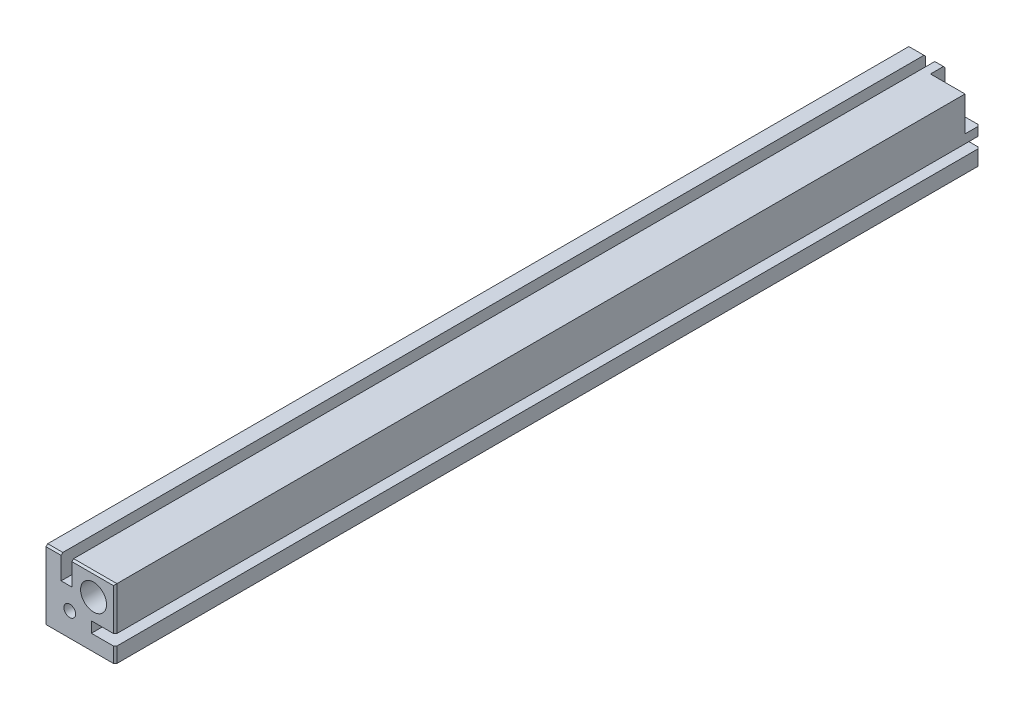
ISO-10303-21;
HEADER;
FILE_DESCRIPTION(('STEP AP214'),'2;1');
FILE_NAME('part.step','',(''),(''),'','','');
FILE_SCHEMA(('AUTOMOTIVE_DESIGN { 1 0 10303 214 1 1 1 1 }'));
ENDSEC;
DATA;
#1=APPLICATION_CONTEXT('core data for automotive mechanical design processes');
#2=APPLICATION_PROTOCOL_DEFINITION('international standard','automotive_design',2000,#1);
#3=PRODUCT_CONTEXT('',#1,'mechanical');
#4=PRODUCT('Part','Part','',(#3));
#5=PRODUCT_RELATED_PRODUCT_CATEGORY('part','',(#4));
#6=PRODUCT_DEFINITION_FORMATION('','',#4);
#7=PRODUCT_DEFINITION_CONTEXT('part definition',#1,'design');
#8=PRODUCT_DEFINITION('design','',#6,#7);
#9=PRODUCT_DEFINITION_SHAPE('','',#8);
#10=(LENGTH_UNIT() NAMED_UNIT(*) SI_UNIT(.MILLI.,.METRE.));
#11=(NAMED_UNIT(*) PLANE_ANGLE_UNIT() SI_UNIT($,.RADIAN.));
#12=(NAMED_UNIT(*) SI_UNIT($,.STERADIAN.) SOLID_ANGLE_UNIT());
#13=UNCERTAINTY_MEASURE_WITH_UNIT(LENGTH_MEASURE(1.E-05),#10,'distance_accuracy_value','');
#14=(GEOMETRIC_REPRESENTATION_CONTEXT(3) GLOBAL_UNCERTAINTY_ASSIGNED_CONTEXT((#13)) GLOBAL_UNIT_ASSIGNED_CONTEXT((#10,
#11,#12)) REPRESENTATION_CONTEXT('',''));
#15=CARTESIAN_POINT('',(0.,0.,0.));
#16=DIRECTION('',(0.,0.,1.));
#17=DIRECTION('',(1.,0.,0.));
#18=AXIS2_PLACEMENT_3D('',#15,#16,#17);
#19=CARTESIAN_POINT('',(-376.613644946817,-0.765886699507383,200.));
#20=DIRECTION('',(-1.,0.,0.));
#21=DIRECTION('',(0.,-1.,0.));
#22=AXIS2_PLACEMENT_3D('',#19,#20,#21);
#23=PLANE('',#22);
#24=DIRECTION('',(0.,0.,1.));
#25=VECTOR('',#24,1.);
#26=CARTESIAN_POINT('',(-376.613644946817,-13.2658866995074,0.));
#27=LINE('',#26,#25);
#28=CARTESIAN_POINT('',(-376.613644946817,-13.2658866995074,0.400000000000073));
#29=VERTEX_POINT('',#28);
#30=CARTESIAN_POINT('',(-376.613644946817,-13.2658866995074,199.6));
#31=VERTEX_POINT('',#30);
#32=EDGE_CURVE('E270',#29,#31,#27,.T.);
#33=ORIENTED_EDGE('',*,*,#32,.T.);
#34=DIRECTION('',(0.,-1.,0.));
#35=VECTOR('',#34,1.);
#36=CARTESIAN_POINT('',(-376.613644946817,-16.7658866995074,199.6));
#37=LINE('',#36,#35);
#38=CARTESIAN_POINT('',(-376.613644946817,-16.7658866995074,199.6));
#39=VERTEX_POINT('',#38);
#40=EDGE_CURVE('E351',#31,#39,#37,.T.);
#41=ORIENTED_EDGE('',*,*,#40,.T.);
#42=DIRECTION('',(0.,0.,-1.));
#43=VECTOR('',#42,1.);
#44=CARTESIAN_POINT('',(-376.613644946817,-16.7658866995074,200.));
#45=LINE('',#44,#43);
#46=CARTESIAN_POINT('',(-376.613644946817,-16.7658866995074,0.400000000000073));
#47=VERTEX_POINT('',#46);
#48=EDGE_CURVE('E318',#39,#47,#45,.T.);
#49=ORIENTED_EDGE('',*,*,#48,.T.);
#50=DIRECTION('',(0.,1.,0.));
#51=VECTOR('',#50,1.);
#52=CARTESIAN_POINT('',(-376.613644946817,-0.765886699507383,0.400000000000073));
#53=LINE('',#52,#51);
#54=EDGE_CURVE('E348',#47,#29,#53,.T.);
#55=ORIENTED_EDGE('',*,*,#54,.T.);
#56=EDGE_LOOP('',(#33,#41,#49,#55));
#57=FACE_BOUND('',#56,.T.);
#58=ADVANCED_FACE('F34',(#57),#23,.F.);
#59=CARTESIAN_POINT('',(-392.613644946817,-0.765886699507383,200.));
#60=DIRECTION('',(0.,-1.,0.));
#61=DIRECTION('',(0.,0.,-1.));
#62=AXIS2_PLACEMENT_3D('',#59,#60,#61);
#63=PLANE('',#62);
#64=DIRECTION('',(0.,0.,-1.));
#65=VECTOR('',#64,1.);
#66=CARTESIAN_POINT('',(-392.613644946817,-0.765886699507383,200.));
#67=LINE('',#66,#65);
#68=CARTESIAN_POINT('',(-392.613644946817,-0.765886699507383,199.6));
#69=VERTEX_POINT('',#68);
#70=CARTESIAN_POINT('',(-392.613644946817,-0.765886699507383,0.400000000000073));
#71=VERTEX_POINT('',#70);
#72=EDGE_CURVE('E327',#69,#71,#67,.T.);
#73=ORIENTED_EDGE('',*,*,#72,.F.);
#74=DIRECTION('',(1.,0.,0.));
#75=VECTOR('',#74,1.);
#76=CARTESIAN_POINT('',(-389.113644946817,-0.765886699507383,199.6));
#77=LINE('',#76,#75);
#78=CARTESIAN_POINT('',(-389.113644946817,-0.765886699507383,199.6));
#79=VERTEX_POINT('',#78);
#80=EDGE_CURVE('E380',#69,#79,#77,.T.);
#81=ORIENTED_EDGE('',*,*,#80,.T.);
#82=DIRECTION('',(0.,0.,1.));
#83=VECTOR('',#82,1.);
#84=CARTESIAN_POINT('',(-389.113644946817,-0.765886699507383,0.));
#85=LINE('',#84,#83);
#86=CARTESIAN_POINT('',(-389.113644946817,-0.765886699507383,0.400000000000073));
#87=VERTEX_POINT('',#86);
#88=EDGE_CURVE('E275',#87,#79,#85,.T.);
#89=ORIENTED_EDGE('',*,*,#88,.F.);
#90=DIRECTION('',(-1.,0.,0.));
#91=VECTOR('',#90,1.);
#92=CARTESIAN_POINT('',(-392.613644946817,-0.765886699507383,0.400000000000073));
#93=LINE('',#92,#91);
#94=EDGE_CURVE('E377',#87,#71,#93,.T.);
#95=ORIENTED_EDGE('',*,*,#94,.T.);
#96=EDGE_LOOP('',(#73,#81,#89,#95));
#97=FACE_BOUND('',#96,.T.);
#98=ADVANCED_FACE('F441',(#97),#63,.F.);
#99=DIRECTION('',(0.,0.,-1.));
#100=VECTOR('',#99,1.);
#101=CARTESIAN_POINT('',(-376.613644946817,-8.76588669950738,3.00000000000011));
#102=LINE('',#101,#100);
#103=CARTESIAN_POINT('',(-376.613644946817,-8.76588669950738,3.4000000000001));
#104=VERTEX_POINT('',#103);
#105=CARTESIAN_POINT('',(-376.613644946817,-8.76588669950738,0.400000000000079));
#106=VERTEX_POINT('',#105);
#107=EDGE_CURVE('E58',#104,#106,#102,.T.);
#108=ORIENTED_EDGE('',*,*,#107,.F.);
#109=DIRECTION('',(0.,1.,0.));
#110=VECTOR('',#109,1.);
#111=CARTESIAN_POINT('',(-376.613644946817,-0.765886699507383,3.4000000000001));
#112=LINE('',#111,#110);
#113=CARTESIAN_POINT('',(-376.613644946817,-0.765886699507383,3.4000000000001));
#114=VERTEX_POINT('',#113);
#115=EDGE_CURVE('E404',#104,#114,#112,.T.);
#116=ORIENTED_EDGE('',*,*,#115,.T.);
#117=DIRECTION('',(0.,0.,-1.));
#118=VECTOR('',#117,1.);
#119=CARTESIAN_POINT('',(-376.613644946817,-0.765886699507383,200.));
#120=LINE('',#119,#118);
#121=CARTESIAN_POINT('',(-376.613644946817,-0.765886699507383,199.6));
#122=VERTEX_POINT('',#121);
#123=EDGE_CURVE('E330',#122,#114,#120,.T.);
#124=ORIENTED_EDGE('',*,*,#123,.F.);
#125=DIRECTION('',(0.,-1.,0.));
#126=VECTOR('',#125,1.);
#127=CARTESIAN_POINT('',(-376.613644946817,-10.7658866995074,199.6));
#128=LINE('',#127,#126);
#129=CARTESIAN_POINT('',(-376.613644946817,-10.7658866995074,199.6));
#130=VERTEX_POINT('',#129);
#131=EDGE_CURVE('E359',#122,#130,#128,.T.);
#132=ORIENTED_EDGE('',*,*,#131,.T.);
#133=DIRECTION('',(0.,0.,1.));
#134=VECTOR('',#133,1.);
#135=CARTESIAN_POINT('',(-376.613644946817,-10.7658866995074,0.));
#136=LINE('',#135,#134);
#137=CARTESIAN_POINT('',(-376.613644946817,-10.7658866995074,0.400000000000073));
#138=VERTEX_POINT('',#137);
#139=EDGE_CURVE('E295',#138,#130,#136,.T.);
#140=ORIENTED_EDGE('',*,*,#139,.F.);
#141=DIRECTION('',(0.,1.,0.));
#142=VECTOR('',#141,1.);
#143=CARTESIAN_POINT('',(-376.613644946817,-0.765886699507383,0.400000000000073));
#144=LINE('',#143,#142);
#145=EDGE_CURVE('E357',#138,#106,#144,.T.);
#146=ORIENTED_EDGE('',*,*,#145,.T.);
#147=EDGE_LOOP('',(#108,#116,#124,#132,#140,#146));
#148=FACE_BOUND('',#147,.T.);
#149=ADVANCED_FACE('F418',(#148),#23,.F.);
#150=ORIENTED_EDGE('',*,*,#123,.T.);
#151=DIRECTION('',(-1.,0.,0.));
#152=VECTOR('',#151,1.);
#153=CARTESIAN_POINT('',(-384.613644946817,-0.765886699507383,3.4000000000001));
#154=LINE('',#153,#152);
#155=CARTESIAN_POINT('',(-384.613644946817,-0.765886699507383,3.4000000000001));
#156=VERTEX_POINT('',#155);
#157=EDGE_CURVE('E406',#114,#156,#154,.T.);
#158=ORIENTED_EDGE('',*,*,#157,.T.);
#159=DIRECTION('',(0.,0.,-1.));
#160=VECTOR('',#159,1.);
#161=CARTESIAN_POINT('',(-384.613644946817,-0.765886699507383,3.00000000000011));
#162=LINE('',#161,#160);
#163=CARTESIAN_POINT('',(-384.613644946817,-0.765886699507383,0.400000000000073));
#164=VERTEX_POINT('',#163);
#165=EDGE_CURVE('E50',#156,#164,#162,.T.);
#166=ORIENTED_EDGE('',*,*,#165,.T.);
#167=DIRECTION('',(-1.,0.,0.));
#168=VECTOR('',#167,1.);
#169=CARTESIAN_POINT('',(-392.613644946817,-0.765886699507383,0.400000000000073));
#170=LINE('',#169,#168);
#171=CARTESIAN_POINT('',(-386.613644946817,-0.765886699507383,0.400000000000073));
#172=VERTEX_POINT('',#171);
#173=EDGE_CURVE('E369',#164,#172,#170,.T.);
#174=ORIENTED_EDGE('',*,*,#173,.T.);
#175=DIRECTION('',(0.,0.,1.));
#176=VECTOR('',#175,1.);
#177=CARTESIAN_POINT('',(-386.613644946817,-0.765886699507383,0.));
#178=LINE('',#177,#176);
#179=CARTESIAN_POINT('',(-386.613644946817,-0.765886699507383,199.6));
#180=VERTEX_POINT('',#179);
#181=EDGE_CURVE('E279',#172,#180,#178,.T.);
#182=ORIENTED_EDGE('',*,*,#181,.T.);
#183=DIRECTION('',(1.,0.,0.));
#184=VECTOR('',#183,1.);
#185=CARTESIAN_POINT('',(-376.613644946817,-0.765886699507383,199.6));
#186=LINE('',#185,#184);
#187=EDGE_CURVE('E371',#180,#122,#186,.T.);
#188=ORIENTED_EDGE('',*,*,#187,.T.);
#189=EDGE_LOOP('',(#150,#158,#166,#174,#182,#188));
#190=FACE_BOUND('',#189,.T.);
#191=ADVANCED_FACE('F422',(#190),#63,.F.);
#192=CARTESIAN_POINT('',(-392.613644946817,-0.765886699507383,200.));
#193=DIRECTION('',(1.,0.,0.));
#194=DIRECTION('',(0.,1.,0.));
#195=AXIS2_PLACEMENT_3D('',#192,#193,#194);
#196=PLANE('',#195);
#197=DIRECTION('',(0.,-1.,0.));
#198=VECTOR('',#197,1.);
#199=CARTESIAN_POINT('',(-392.613644946817,-0.765886699507383,200.));
#200=LINE('',#199,#198);
#201=CARTESIAN_POINT('',(-392.613644946817,-1.16588669950739,200.));
#202=VERTEX_POINT('',#201);
#203=CARTESIAN_POINT('',(-392.613644946817,-16.7658866995074,200.));
#204=VERTEX_POINT('',#203);
#205=EDGE_CURVE('E312',#202,#204,#200,.T.);
#206=ORIENTED_EDGE('',*,*,#205,.F.);
#207=DIRECTION('',(0.,0.707106781186548,-0.707106781186548));
#208=VECTOR('',#207,1.);
#209=CARTESIAN_POINT('',(-392.613644946817,-1.16588669950739,200.));
#210=LINE('',#209,#208);
#211=EDGE_CURVE('E375',#202,#69,#210,.T.);
#212=ORIENTED_EDGE('',*,*,#211,.T.);
#213=ORIENTED_EDGE('',*,*,#72,.T.);
#214=DIRECTION('',(0.,0.707106781186548,0.707106781186548));
#215=VECTOR('',#214,1.);
#216=CARTESIAN_POINT('',(-392.613644946817,-0.765886699507383,0.400000000000073));
#217=LINE('',#216,#215);
#218=CARTESIAN_POINT('',(-392.613644946817,-1.16588669950739,0.));
#219=VERTEX_POINT('',#218);
#220=EDGE_CURVE('E373',#71,#219,#217,.F.);
#221=ORIENTED_EDGE('',*,*,#220,.T.);
#222=DIRECTION('',(0.,-1.,0.));
#223=VECTOR('',#222,1.);
#224=CARTESIAN_POINT('',(-392.613644946817,-0.765886699507383,0.));
#225=LINE('',#224,#223);
#226=CARTESIAN_POINT('',(-392.613644946817,-16.7658866995074,0.));
#227=VERTEX_POINT('',#226);
#228=EDGE_CURVE('E278',#219,#227,#225,.T.);
#229=ORIENTED_EDGE('',*,*,#228,.T.);
#230=DIRECTION('',(0.,0.,-1.));
#231=VECTOR('',#230,1.);
#232=CARTESIAN_POINT('',(-392.613644946817,-16.7658866995074,200.));
#233=LINE('',#232,#231);
#234=EDGE_CURVE('E324',#204,#227,#233,.T.);
#235=ORIENTED_EDGE('',*,*,#234,.F.);
#236=EDGE_LOOP('',(#206,#212,#213,#221,#229,#235));
#237=FACE_BOUND('',#236,.T.);
#238=ADVANCED_FACE('F454',(#237),#196,.F.);
#239=CARTESIAN_POINT('',(-392.613644946817,-16.7658866995074,200.));
#240=DIRECTION('',(0.,1.,0.));
#241=DIRECTION('',(0.,0.,1.));
#242=AXIS2_PLACEMENT_3D('',#239,#240,#241);
#243=PLANE('',#242);
#244=ORIENTED_EDGE('',*,*,#48,.F.);
#245=DIRECTION('',(-0.707106781186548,0.,0.707106781186548));
#246=VECTOR('',#245,1.);
#247=CARTESIAN_POINT('',(-377.013644946817,-16.7658866995074,200.));
#248=LINE('',#247,#246);
#249=CARTESIAN_POINT('',(-377.013644946817,-16.7658866995074,200.));
#250=VERTEX_POINT('',#249);
#251=EDGE_CURVE('E355',#39,#250,#248,.T.);
#252=ORIENTED_EDGE('',*,*,#251,.T.);
#253=DIRECTION('',(1.,0.,0.));
#254=VECTOR('',#253,1.);
#255=CARTESIAN_POINT('',(-392.613644946817,-16.7658866995074,200.));
#256=LINE('',#255,#254);
#257=EDGE_CURVE('E314',#204,#250,#256,.T.);
#258=ORIENTED_EDGE('',*,*,#257,.F.);
#259=ORIENTED_EDGE('',*,*,#234,.T.);
#260=DIRECTION('',(1.,0.,0.));
#261=VECTOR('',#260,1.);
#262=CARTESIAN_POINT('',(-392.613644946817,-16.7658866995074,0.));
#263=LINE('',#262,#261);
#264=CARTESIAN_POINT('',(-377.013644946817,-16.7658866995074,0.));
#265=VERTEX_POINT('',#264);
#266=EDGE_CURVE('E315',#227,#265,#263,.T.);
#267=ORIENTED_EDGE('',*,*,#266,.T.);
#268=DIRECTION('',(-0.707106781186548,0.,-0.707106781186548));
#269=VECTOR('',#268,1.);
#270=CARTESIAN_POINT('',(-376.613644946817,-16.7658866995074,0.400000000000071));
#271=LINE('',#270,#269);
#272=EDGE_CURVE('E353',#265,#47,#271,.F.);
#273=ORIENTED_EDGE('',*,*,#272,.T.);
#274=EDGE_LOOP('',(#244,#252,#258,#259,#267,#273));
#275=FACE_BOUND('',#274,.T.);
#276=ADVANCED_FACE('F458',(#275),#243,.F.);
#277=CARTESIAN_POINT('',(-384.613644946817,-8.76588669950738,200.));
#278=DIRECTION('',(0.,0.,1.));
#279=DIRECTION('',(1.,0.,0.));
#280=AXIS2_PLACEMENT_3D('',#277,#278,#279);
#281=PLANE('',#280);
#282=CARTESIAN_POINT('',(-381.613644946817,-5.76588669950738,200.));
#283=DIRECTION('',(0.,0.,-1.));
#284=DIRECTION('',(-1.,0.,0.));
#285=AXIS2_PLACEMENT_3D('',#282,#283,#284);
#286=CIRCLE('',#285,2.99999999999999);
#287=CARTESIAN_POINT('',(-384.613644946817,-5.76588669950738,200.));
#288=VERTEX_POINT('',#287);
#289=EDGE_CURVE('E220',#288,#288,#286,.T.);
#290=ORIENTED_EDGE('',*,*,#289,.T.);
#291=EDGE_LOOP('',(#290));
#292=FACE_BOUND('',#291,.T.);
#293=CARTESIAN_POINT('',(-387.113644946817,-11.2658866995074,200.));
#294=DIRECTION('',(0.,0.,1.));
#295=DIRECTION('',(1.,0.,0.));
#296=AXIS2_PLACEMENT_3D('',#293,#294,#295);
#297=CIRCLE('',#296,1.34999999999999);
#298=CARTESIAN_POINT('',(-385.763644946817,-11.2658866995074,200.));
#299=VERTEX_POINT('',#298);
#300=EDGE_CURVE('E242',#299,#299,#297,.T.);
#301=ORIENTED_EDGE('',*,*,#300,.F.);
#302=EDGE_LOOP('',(#301));
#303=FACE_BOUND('',#302,.T.);
#304=ORIENTED_EDGE('',*,*,#257,.T.);
#305=DIRECTION('',(0.,1.,0.));
#306=VECTOR('',#305,1.);
#307=CARTESIAN_POINT('',(-377.013644946817,-13.2658866995074,200.));
#308=LINE('',#307,#306);
#309=CARTESIAN_POINT('',(-377.013644946817,-13.2658866995074,200.));
#310=VERTEX_POINT('',#309);
#311=EDGE_CURVE('E341',#250,#310,#308,.T.);
#312=ORIENTED_EDGE('',*,*,#311,.T.);
#313=DIRECTION('',(1.,0.,0.));
#314=VECTOR('',#313,1.);
#315=CARTESIAN_POINT('',(-376.613644946817,-13.2658866995074,200.));
#316=LINE('',#315,#314);
#317=CARTESIAN_POINT('',(-382.113644946817,-13.2658866995074,200.));
#318=VERTEX_POINT('',#317);
#319=EDGE_CURVE('E289',#318,#310,#316,.T.);
#320=ORIENTED_EDGE('',*,*,#319,.F.);
#321=DIRECTION('',(0.,-1.,0.));
#322=VECTOR('',#321,1.);
#323=CARTESIAN_POINT('',(-382.113644946817,-13.2658866995074,200.));
#324=LINE('',#323,#322);
#325=CARTESIAN_POINT('',(-382.113644946817,-10.7658866995074,200.));
#326=VERTEX_POINT('',#325);
#327=EDGE_CURVE('E298',#326,#318,#324,.T.);
#328=ORIENTED_EDGE('',*,*,#327,.F.);
#329=DIRECTION('',(-1.,0.,0.));
#330=VECTOR('',#329,1.);
#331=CARTESIAN_POINT('',(-376.613644946817,-10.7658866995074,200.));
#332=LINE('',#331,#330);
#333=CARTESIAN_POINT('',(-377.013644946817,-10.7658866995074,200.));
#334=VERTEX_POINT('',#333);
#335=EDGE_CURVE('E296',#334,#326,#332,.T.);
#336=ORIENTED_EDGE('',*,*,#335,.F.);
#337=DIRECTION('',(0.,1.,0.));
#338=VECTOR('',#337,1.);
#339=CARTESIAN_POINT('',(-377.013644946817,-0.765886699507383,200.));
#340=LINE('',#339,#338);
#341=CARTESIAN_POINT('',(-377.013644946817,-1.16588669950739,200.));
#342=VERTEX_POINT('',#341);
#343=EDGE_CURVE('E338',#334,#342,#340,.T.);
#344=ORIENTED_EDGE('',*,*,#343,.T.);
#345=DIRECTION('',(-1.,0.,0.));
#346=VECTOR('',#345,1.);
#347=CARTESIAN_POINT('',(-386.613644946817,-1.16588669950739,200.));
#348=LINE('',#347,#346);
#349=CARTESIAN_POINT('',(-386.613644946817,-1.16588669950739,200.));
#350=VERTEX_POINT('',#349);
#351=EDGE_CURVE('E336',#342,#350,#348,.T.);
#352=ORIENTED_EDGE('',*,*,#351,.T.);
#353=DIRECTION('',(0.,1.,0.));
#354=VECTOR('',#353,1.);
#355=CARTESIAN_POINT('',(-386.613644946817,-0.765886699507383,200.));
#356=LINE('',#355,#354);
#357=CARTESIAN_POINT('',(-386.613644946817,-6.26588669950738,200.));
#358=VERTEX_POINT('',#357);
#359=EDGE_CURVE('E260',#358,#350,#356,.T.);
#360=ORIENTED_EDGE('',*,*,#359,.F.);
#361=DIRECTION('',(1.,0.,0.));
#362=VECTOR('',#361,1.);
#363=CARTESIAN_POINT('',(-389.113644946817,-6.26588669950738,200.));
#364=LINE('',#363,#362);
#365=CARTESIAN_POINT('',(-389.113644946817,-6.26588669950738,200.));
#366=VERTEX_POINT('',#365);
#367=EDGE_CURVE('E269',#366,#358,#364,.T.);
#368=ORIENTED_EDGE('',*,*,#367,.F.);
#369=DIRECTION('',(0.,-1.,0.));
#370=VECTOR('',#369,1.);
#371=CARTESIAN_POINT('',(-389.113644946817,-0.765886699507383,200.));
#372=LINE('',#371,#370);
#373=CARTESIAN_POINT('',(-389.113644946817,-1.16588669950739,200.));
#374=VERTEX_POINT('',#373);
#375=EDGE_CURVE('E267',#374,#366,#372,.T.);
#376=ORIENTED_EDGE('',*,*,#375,.F.);
#377=DIRECTION('',(-1.,0.,0.));
#378=VECTOR('',#377,1.);
#379=CARTESIAN_POINT('',(-392.613644946817,-1.16588669950739,200.));
#380=LINE('',#379,#378);
#381=EDGE_CURVE('E333',#374,#202,#380,.T.);
#382=ORIENTED_EDGE('',*,*,#381,.T.);
#383=ORIENTED_EDGE('',*,*,#205,.T.);
#384=EDGE_LOOP('',(#304,#312,#320,#328,#336,#344,#352,#360,#368,#376,#382,#383));
#385=FACE_BOUND('',#384,.T.);
#386=ADVANCED_FACE('F429',(#292,#303,#385),#281,.T.);
#387=CARTESIAN_POINT('',(-384.613644946817,-8.76588669950738,0.));
#388=DIRECTION('',(0.,0.,1.));
#389=DIRECTION('',(1.,0.,0.));
#390=AXIS2_PLACEMENT_3D('',#387,#388,#389);
#391=PLANE('',#390);
#392=CARTESIAN_POINT('',(-387.113644946817,-11.2658866995074,0.));
#393=DIRECTION('',(0.,0.,-1.));
#394=DIRECTION('',(-1.,0.,0.));
#395=AXIS2_PLACEMENT_3D('',#392,#393,#394);
#396=CIRCLE('',#395,1.34999999999999);
#397=CARTESIAN_POINT('',(-388.463644946817,-11.2658866995074,0.));
#398=VERTEX_POINT('',#397);
#399=EDGE_CURVE('E250',#398,#398,#396,.T.);
#400=ORIENTED_EDGE('',*,*,#399,.F.);
#401=EDGE_LOOP('',(#400));
#402=FACE_BOUND('',#401,.T.);
#403=DIRECTION('',(1.,0.,0.));
#404=VECTOR('',#403,1.);
#405=CARTESIAN_POINT('',(-384.613644946817,-1.16588669950739,0.));
#406=LINE('',#405,#404);
#407=CARTESIAN_POINT('',(-386.613644946817,-1.16588669950739,0.));
#408=VERTEX_POINT('',#407);
#409=CARTESIAN_POINT('',(-384.613644946817,-1.16588669950739,0.));
#410=VERTEX_POINT('',#409);
#411=EDGE_CURVE('E390',#408,#410,#406,.T.);
#412=ORIENTED_EDGE('',*,*,#411,.T.);
#413=DIRECTION('',(0.,1.,0.));
#414=VECTOR('',#413,1.);
#415=CARTESIAN_POINT('',(-384.613644946817,-0.765886699507383,1.09543937050044E-13));
#416=LINE('',#415,#414);
#417=CARTESIAN_POINT('',(-384.613644946817,-5.76588669950738,1.09543937050044E-13));
#418=VERTEX_POINT('',#417);
#419=EDGE_CURVE('E235',#418,#410,#416,.T.);
#420=ORIENTED_EDGE('',*,*,#419,.F.);
#421=CARTESIAN_POINT('',(-381.613644946817,-5.76588669950738,1.09543937050044E-13));
#422=DIRECTION('',(0.,0.,-1.));
#423=DIRECTION('',(-1.,0.,0.));
#424=AXIS2_PLACEMENT_3D('',#421,#422,#423);
#425=CIRCLE('',#424,3.);
#426=CARTESIAN_POINT('',(-381.613644946817,-8.76588669950739,1.09543937050044E-13));
#427=VERTEX_POINT('',#426);
#428=EDGE_CURVE('E227',#427,#418,#425,.T.);
#429=ORIENTED_EDGE('',*,*,#428,.F.);
#430=DIRECTION('',(-1.,0.,0.));
#431=VECTOR('',#430,1.);
#432=CARTESIAN_POINT('',(-376.613644946817,-8.76588669950738,1.09543937050044E-13));
#433=LINE('',#432,#431);
#434=CARTESIAN_POINT('',(-377.013644946817,-8.76588669950738,1.09543937050044E-13));
#435=VERTEX_POINT('',#434);
#436=EDGE_CURVE('E238',#435,#427,#433,.T.);
#437=ORIENTED_EDGE('',*,*,#436,.F.);
#438=DIRECTION('',(0.,-1.,0.));
#439=VECTOR('',#438,1.);
#440=CARTESIAN_POINT('',(-377.013644946817,-8.76588669950738,0.));
#441=LINE('',#440,#439);
#442=CARTESIAN_POINT('',(-377.013644946817,-10.7658866995074,0.));
#443=VERTEX_POINT('',#442);
#444=EDGE_CURVE('E388',#435,#443,#441,.T.);
#445=ORIENTED_EDGE('',*,*,#444,.T.);
#446=DIRECTION('',(-1.,0.,0.));
#447=VECTOR('',#446,1.);
#448=CARTESIAN_POINT('',(-376.613644946817,-10.7658866995074,0.));
#449=LINE('',#448,#447);
#450=CARTESIAN_POINT('',(-382.113644946817,-10.7658866995074,0.));
#451=VERTEX_POINT('',#450);
#452=EDGE_CURVE('E286',#443,#451,#449,.T.);
#453=ORIENTED_EDGE('',*,*,#452,.T.);
#454=DIRECTION('',(0.,-1.,0.));
#455=VECTOR('',#454,1.);
#456=CARTESIAN_POINT('',(-382.113644946817,-13.2658866995074,0.));
#457=LINE('',#456,#455);
#458=CARTESIAN_POINT('',(-382.113644946817,-13.2658866995074,0.));
#459=VERTEX_POINT('',#458);
#460=EDGE_CURVE('E288',#451,#459,#457,.T.);
#461=ORIENTED_EDGE('',*,*,#460,.T.);
#462=DIRECTION('',(1.,0.,0.));
#463=VECTOR('',#462,1.);
#464=CARTESIAN_POINT('',(-376.613644946817,-13.2658866995074,0.));
#465=LINE('',#464,#463);
#466=CARTESIAN_POINT('',(-377.013644946817,-13.2658866995074,0.));
#467=VERTEX_POINT('',#466);
#468=EDGE_CURVE('E292',#459,#467,#465,.T.);
#469=ORIENTED_EDGE('',*,*,#468,.T.);
#470=DIRECTION('',(0.,-1.,0.));
#471=VECTOR('',#470,1.);
#472=CARTESIAN_POINT('',(-377.013644946817,-8.76588669950738,0.));
#473=LINE('',#472,#471);
#474=EDGE_CURVE('E393',#467,#265,#473,.T.);
#475=ORIENTED_EDGE('',*,*,#474,.T.);
#476=ORIENTED_EDGE('',*,*,#266,.F.);
#477=ORIENTED_EDGE('',*,*,#228,.F.);
#478=DIRECTION('',(1.,0.,0.));
#479=VECTOR('',#478,1.);
#480=CARTESIAN_POINT('',(-384.613644946817,-1.16588669950739,0.));
#481=LINE('',#480,#479);
#482=CARTESIAN_POINT('',(-389.113644946817,-1.16588669950739,0.));
#483=VERTEX_POINT('',#482);
#484=EDGE_CURVE('E386',#219,#483,#481,.T.);
#485=ORIENTED_EDGE('',*,*,#484,.T.);
#486=DIRECTION('',(0.,-1.,0.));
#487=VECTOR('',#486,1.);
#488=CARTESIAN_POINT('',(-389.113644946817,-0.765886699507383,0.));
#489=LINE('',#488,#487);
#490=CARTESIAN_POINT('',(-389.113644946817,-6.26588669950738,0.));
#491=VERTEX_POINT('',#490);
#492=EDGE_CURVE('E257',#483,#491,#489,.T.);
#493=ORIENTED_EDGE('',*,*,#492,.T.);
#494=DIRECTION('',(1.,0.,0.));
#495=VECTOR('',#494,1.);
#496=CARTESIAN_POINT('',(-389.113644946817,-6.26588669950738,0.));
#497=LINE('',#496,#495);
#498=CARTESIAN_POINT('',(-386.613644946817,-6.26588669950738,0.));
#499=VERTEX_POINT('',#498);
#500=EDGE_CURVE('E259',#491,#499,#497,.T.);
#501=ORIENTED_EDGE('',*,*,#500,.T.);
#502=DIRECTION('',(0.,1.,0.));
#503=VECTOR('',#502,1.);
#504=CARTESIAN_POINT('',(-386.613644946817,-0.765886699507383,0.));
#505=LINE('',#504,#503);
#506=EDGE_CURVE('E263',#499,#408,#505,.T.);
#507=ORIENTED_EDGE('',*,*,#506,.T.);
#508=EDGE_LOOP('',(#412,#420,#429,#437,#445,#453,#461,#469,#475,#476,#477,#485,#493,#501,#507));
#509=FACE_BOUND('',#508,.T.);
#510=ADVANCED_FACE('F465',(#402,#509),#391,.F.);
#511=CARTESIAN_POINT('',(-376.613644946817,-13.2658866995074,0.));
#512=DIRECTION('',(0.,-1.,0.));
#513=DIRECTION('',(1.,0.,0.));
#514=AXIS2_PLACEMENT_3D('',#511,#512,#513);
#515=PLANE('',#514);
#516=ORIENTED_EDGE('',*,*,#319,.T.);
#517=DIRECTION('',(0.707106781186548,0.,-0.707106781186548));
#518=VECTOR('',#517,1.);
#519=CARTESIAN_POINT('',(-377.013644946817,-13.2658866995074,200.));
#520=LINE('',#519,#518);
#521=EDGE_CURVE('E346',#310,#31,#520,.T.);
#522=ORIENTED_EDGE('',*,*,#521,.T.);
#523=ORIENTED_EDGE('',*,*,#32,.F.);
#524=DIRECTION('',(0.707106781186548,0.,0.707106781186548));
#525=VECTOR('',#524,1.);
#526=CARTESIAN_POINT('',(-376.613644946817,-13.2658866995074,0.400000000000072));
#527=LINE('',#526,#525);
#528=EDGE_CURVE('E344',#29,#467,#527,.F.);
#529=ORIENTED_EDGE('',*,*,#528,.T.);
#530=ORIENTED_EDGE('',*,*,#468,.F.);
#531=DIRECTION('',(0.,0.,1.));
#532=VECTOR('',#531,1.);
#533=CARTESIAN_POINT('',(-382.113644946817,-13.2658866995074,0.));
#534=LINE('',#533,#532);
#535=EDGE_CURVE('E305',#459,#318,#534,.T.);
#536=ORIENTED_EDGE('',*,*,#535,.T.);
#537=EDGE_LOOP('',(#516,#522,#523,#529,#530,#536));
#538=FACE_BOUND('',#537,.T.);
#539=ADVANCED_FACE('F468',(#538),#515,.F.);
#540=CARTESIAN_POINT('',(-382.113644946817,-13.2658866995074,0.));
#541=DIRECTION('',(-1.,0.,0.));
#542=DIRECTION('',(0.,0.,1.));
#543=AXIS2_PLACEMENT_3D('',#540,#541,#542);
#544=PLANE('',#543);
#545=ORIENTED_EDGE('',*,*,#327,.T.);
#546=ORIENTED_EDGE('',*,*,#535,.F.);
#547=ORIENTED_EDGE('',*,*,#460,.F.);
#548=DIRECTION('',(0.,0.,1.));
#549=VECTOR('',#548,1.);
#550=CARTESIAN_POINT('',(-382.113644946817,-10.7658866995074,0.));
#551=LINE('',#550,#549);
#552=EDGE_CURVE('E307',#451,#326,#551,.T.);
#553=ORIENTED_EDGE('',*,*,#552,.T.);
#554=EDGE_LOOP('',(#545,#546,#547,#553));
#555=FACE_BOUND('',#554,.T.);
#556=ADVANCED_FACE('F476',(#555),#544,.F.);
#557=CARTESIAN_POINT('',(-376.613644946817,-10.7658866995074,0.));
#558=DIRECTION('',(0.,1.,0.));
#559=DIRECTION('',(-1.,0.,0.));
#560=AXIS2_PLACEMENT_3D('',#557,#558,#559);
#561=PLANE('',#560);
#562=ORIENTED_EDGE('',*,*,#139,.T.);
#563=DIRECTION('',(-0.707106781186548,0.,0.707106781186548));
#564=VECTOR('',#563,1.);
#565=CARTESIAN_POINT('',(-377.013644946817,-10.7658866995074,200.));
#566=LINE('',#565,#564);
#567=EDGE_CURVE('E363',#130,#334,#566,.T.);
#568=ORIENTED_EDGE('',*,*,#567,.T.);
#569=ORIENTED_EDGE('',*,*,#335,.T.);
#570=ORIENTED_EDGE('',*,*,#552,.F.);
#571=ORIENTED_EDGE('',*,*,#452,.F.);
#572=DIRECTION('',(-0.707106781186548,0.,-0.707106781186548));
#573=VECTOR('',#572,1.);
#574=CARTESIAN_POINT('',(-376.613644946817,-10.7658866995074,0.400000000000072));
#575=LINE('',#574,#573);
#576=EDGE_CURVE('E361',#443,#138,#575,.F.);
#577=ORIENTED_EDGE('',*,*,#576,.T.);
#578=EDGE_LOOP('',(#562,#568,#569,#570,#571,#577));
#579=FACE_BOUND('',#578,.T.);
#580=ADVANCED_FACE('F472',(#579),#561,.F.);
#581=CARTESIAN_POINT('',(-389.113644946817,-0.765886699507383,0.));
#582=DIRECTION('',(-1.,0.,0.));
#583=DIRECTION('',(0.,-1.,0.));
#584=AXIS2_PLACEMENT_3D('',#581,#582,#583);
#585=PLANE('',#584);
#586=ORIENTED_EDGE('',*,*,#88,.T.);
#587=DIRECTION('',(0.,-0.707106781186548,0.707106781186548));
#588=VECTOR('',#587,1.);
#589=CARTESIAN_POINT('',(-389.113644946817,-1.16588669950739,200.));
#590=LINE('',#589,#588);
#591=EDGE_CURVE('E384',#79,#374,#590,.T.);
#592=ORIENTED_EDGE('',*,*,#591,.T.);
#593=ORIENTED_EDGE('',*,*,#375,.T.);
#594=DIRECTION('',(0.,0.,1.));
#595=VECTOR('',#594,1.);
#596=CARTESIAN_POINT('',(-389.113644946817,-6.26588669950738,0.));
#597=LINE('',#596,#595);
#598=EDGE_CURVE('E266',#491,#366,#597,.T.);
#599=ORIENTED_EDGE('',*,*,#598,.F.);
#600=ORIENTED_EDGE('',*,*,#492,.F.);
#601=DIRECTION('',(0.,-0.707106781186548,-0.707106781186548));
#602=VECTOR('',#601,1.);
#603=CARTESIAN_POINT('',(-389.113644946817,-0.765886699507383,0.400000000000073));
#604=LINE('',#603,#602);
#605=EDGE_CURVE('E382',#483,#87,#604,.F.);
#606=ORIENTED_EDGE('',*,*,#605,.T.);
#607=EDGE_LOOP('',(#586,#592,#593,#599,#600,#606));
#608=FACE_BOUND('',#607,.T.);
#609=ADVANCED_FACE('F475',(#608),#585,.F.);
#610=CARTESIAN_POINT('',(-386.613644946817,-0.765886699507383,0.));
#611=DIRECTION('',(1.,0.,0.));
#612=DIRECTION('',(0.,1.,0.));
#613=AXIS2_PLACEMENT_3D('',#610,#611,#612);
#614=PLANE('',#613);
#615=ORIENTED_EDGE('',*,*,#359,.T.);
#616=DIRECTION('',(0.,0.707106781186548,-0.707106781186548));
#617=VECTOR('',#616,1.);
#618=CARTESIAN_POINT('',(-386.613644946817,-1.16588669950739,200.));
#619=LINE('',#618,#617);
#620=EDGE_CURVE('E367',#350,#180,#619,.T.);
#621=ORIENTED_EDGE('',*,*,#620,.T.);
#622=ORIENTED_EDGE('',*,*,#181,.F.);
#623=DIRECTION('',(0.,0.707106781186548,0.707106781186548));
#624=VECTOR('',#623,1.);
#625=CARTESIAN_POINT('',(-386.613644946817,-0.765886699507383,0.400000000000073));
#626=LINE('',#625,#624);
#627=EDGE_CURVE('E365',#172,#408,#626,.F.);
#628=ORIENTED_EDGE('',*,*,#627,.T.);
#629=ORIENTED_EDGE('',*,*,#506,.F.);
#630=DIRECTION('',(0.,0.,1.));
#631=VECTOR('',#630,1.);
#632=CARTESIAN_POINT('',(-386.613644946817,-6.26588669950738,0.));
#633=LINE('',#632,#631);
#634=EDGE_CURVE('E282',#499,#358,#633,.T.);
#635=ORIENTED_EDGE('',*,*,#634,.T.);
#636=EDGE_LOOP('',(#615,#621,#622,#628,#629,#635));
#637=FACE_BOUND('',#636,.T.);
#638=ADVANCED_FACE('F486',(#637),#614,.F.);
#639=CARTESIAN_POINT('',(-389.113644946817,-6.26588669950738,0.));
#640=DIRECTION('',(0.,-1.,0.));
#641=DIRECTION('',(0.,0.,-1.));
#642=AXIS2_PLACEMENT_3D('',#639,#640,#641);
#643=PLANE('',#642);
#644=ORIENTED_EDGE('',*,*,#367,.T.);
#645=ORIENTED_EDGE('',*,*,#634,.F.);
#646=ORIENTED_EDGE('',*,*,#500,.F.);
#647=ORIENTED_EDGE('',*,*,#598,.T.);
#648=EDGE_LOOP('',(#644,#645,#646,#647));
#649=FACE_BOUND('',#648,.T.);
#650=ADVANCED_FACE('F488',(#649),#643,.F.);
#651=CARTESIAN_POINT('',(-377.013644946817,-8.76588669950738,200.));
#652=DIRECTION('',(0.707106781186548,0.,0.707106781186548));
#653=DIRECTION('',(0.,-1.,0.));
#654=AXIS2_PLACEMENT_3D('',#651,#652,#653);
#655=PLANE('',#654);
#656=ORIENTED_EDGE('',*,*,#251,.F.);
#657=ORIENTED_EDGE('',*,*,#40,.F.);
#658=ORIENTED_EDGE('',*,*,#521,.F.);
#659=ORIENTED_EDGE('',*,*,#311,.F.);
#660=EDGE_LOOP('',(#656,#657,#658,#659));
#661=FACE_BOUND('',#660,.T.);
#662=ADVANCED_FACE('F491',(#661),#655,.T.);
#663=CARTESIAN_POINT('',(-384.613644946817,-1.16588669950739,200.));
#664=DIRECTION('',(0.,0.707106781186548,0.707106781186548));
#665=DIRECTION('',(1.,0.,0.));
#666=AXIS2_PLACEMENT_3D('',#663,#664,#665);
#667=PLANE('',#666);
#668=ORIENTED_EDGE('',*,*,#620,.F.);
#669=ORIENTED_EDGE('',*,*,#351,.F.);
#670=DIRECTION('',(0.577350269189626,0.577350269189626,-0.577350269189626));
#671=VECTOR('',#670,1.);
#672=CARTESIAN_POINT('',(-379.54697828015,-3.69922003284072,202.533333333333));
#673=LINE('',#672,#671);
#674=EDGE_CURVE('E256',#122,#342,#673,.F.);
#675=ORIENTED_EDGE('',*,*,#674,.F.);
#676=ORIENTED_EDGE('',*,*,#187,.F.);
#677=EDGE_LOOP('',(#668,#669,#675,#676));
#678=FACE_BOUND('',#677,.T.);
#679=ADVANCED_FACE('F549',(#678),#667,.T.);
#680=CARTESIAN_POINT('',(-377.013644946817,-8.76588669950738,200.));
#681=DIRECTION('',(0.707106781186548,0.,0.707106781186548));
#682=DIRECTION('',(0.,-1.,0.));
#683=AXIS2_PLACEMENT_3D('',#680,#681,#682);
#684=PLANE('',#683);
#685=ORIENTED_EDGE('',*,*,#567,.F.);
#686=ORIENTED_EDGE('',*,*,#131,.F.);
#687=ORIENTED_EDGE('',*,*,#674,.T.);
#688=ORIENTED_EDGE('',*,*,#343,.F.);
#689=EDGE_LOOP('',(#685,#686,#687,#688));
#690=FACE_BOUND('',#689,.T.);
#691=ADVANCED_FACE('F544',(#690),#684,.T.);
#692=CARTESIAN_POINT('',(-384.613644946817,-1.16588669950739,200.));
#693=DIRECTION('',(0.,0.707106781186548,0.707106781186548));
#694=DIRECTION('',(1.,0.,0.));
#695=AXIS2_PLACEMENT_3D('',#692,#693,#694);
#696=PLANE('',#695);
#697=ORIENTED_EDGE('',*,*,#591,.F.);
#698=ORIENTED_EDGE('',*,*,#80,.F.);
#699=ORIENTED_EDGE('',*,*,#211,.F.);
#700=ORIENTED_EDGE('',*,*,#381,.F.);
#701=EDGE_LOOP('',(#697,#698,#699,#700));
#702=FACE_BOUND('',#701,.T.);
#703=ADVANCED_FACE('F560',(#702),#696,.T.);
#704=CARTESIAN_POINT('',(-376.613644946817,-0.765886699507383,0.400000000000073));
#705=DIRECTION('',(-0.707106781186548,0.,0.707106781186548));
#706=DIRECTION('',(0.,1.,0.));
#707=AXIS2_PLACEMENT_3D('',#704,#705,#706);
#708=PLANE('',#707);
#709=ORIENTED_EDGE('',*,*,#272,.F.);
#710=ORIENTED_EDGE('',*,*,#474,.F.);
#711=ORIENTED_EDGE('',*,*,#528,.F.);
#712=ORIENTED_EDGE('',*,*,#54,.F.);
#713=EDGE_LOOP('',(#709,#710,#711,#712));
#714=FACE_BOUND('',#713,.T.);
#715=ADVANCED_FACE('F530',(#714),#708,.F.);
#716=CARTESIAN_POINT('',(-376.613644946817,-0.765886699507383,0.400000000000073));
#717=DIRECTION('',(-0.707106781186548,0.,0.707106781186548));
#718=DIRECTION('',(0.,1.,0.));
#719=AXIS2_PLACEMENT_3D('',#716,#717,#718);
#720=PLANE('',#719);
#721=DIRECTION('',(0.707106781186548,0.,0.707106781186548));
#722=VECTOR('',#721,1.);
#723=CARTESIAN_POINT('',(-376.613644946817,-8.76588669950738,0.400000000000072));
#724=LINE('',#723,#722);
#725=EDGE_CURVE('E398',#106,#435,#724,.F.);
#726=ORIENTED_EDGE('',*,*,#725,.F.);
#727=ORIENTED_EDGE('',*,*,#145,.F.);
#728=ORIENTED_EDGE('',*,*,#576,.F.);
#729=ORIENTED_EDGE('',*,*,#444,.F.);
#730=EDGE_LOOP('',(#726,#727,#728,#729));
#731=FACE_BOUND('',#730,.T.);
#732=ADVANCED_FACE('F579',(#731),#720,.F.);
#733=CARTESIAN_POINT('',(-392.613644946817,-0.765886699507383,0.400000000000073));
#734=DIRECTION('',(0.,-0.707106781186548,0.707106781186548));
#735=DIRECTION('',(-1.,0.,0.));
#736=AXIS2_PLACEMENT_3D('',#733,#734,#735);
#737=PLANE('',#736);
#738=DIRECTION('',(0.,-0.707106781186548,-0.707106781186548));
#739=VECTOR('',#738,1.);
#740=CARTESIAN_POINT('',(-384.613644946817,-0.765886699507383,0.400000000000073));
#741=LINE('',#740,#739);
#742=EDGE_CURVE('E395',#410,#164,#741,.F.);
#743=ORIENTED_EDGE('',*,*,#742,.F.);
#744=ORIENTED_EDGE('',*,*,#411,.F.);
#745=ORIENTED_EDGE('',*,*,#627,.F.);
#746=ORIENTED_EDGE('',*,*,#173,.F.);
#747=EDGE_LOOP('',(#743,#744,#745,#746));
#748=FACE_BOUND('',#747,.T.);
#749=ADVANCED_FACE('F574',(#748),#737,.F.);
#750=CARTESIAN_POINT('',(-392.613644946817,-0.765886699507383,0.400000000000073));
#751=DIRECTION('',(0.,-0.707106781186548,0.707106781186548));
#752=DIRECTION('',(-1.,0.,0.));
#753=AXIS2_PLACEMENT_3D('',#750,#751,#752);
#754=PLANE('',#753);
#755=ORIENTED_EDGE('',*,*,#605,.F.);
#756=ORIENTED_EDGE('',*,*,#484,.F.);
#757=ORIENTED_EDGE('',*,*,#220,.F.);
#758=ORIENTED_EDGE('',*,*,#94,.F.);
#759=EDGE_LOOP('',(#755,#756,#757,#758));
#760=FACE_BOUND('',#759,.T.);
#761=ADVANCED_FACE('F500',(#760),#754,.F.);
#762=CARTESIAN_POINT('',(-387.113644946817,-11.2658866995074,14.1888381643129));
#763=DIRECTION('',(0.,0.,-1.));
#764=DIRECTION('',(-1.,0.,0.));
#765=AXIS2_PLACEMENT_3D('',#762,#763,#764);
#766=CONICAL_SURFACE('',#765,1.35,1.02974425867665);
#767=CARTESIAN_POINT('',(-387.113644946817,-11.2658866995074,15.0000000000001));
#768=VERTEX_POINT('',#767);
#769=VERTEX_LOOP('',#768);
#770=FACE_BOUND('',#769,.T.);
#771=CARTESIAN_POINT('',(-387.113644946817,-11.2658866995074,14.1888381643129));
#772=DIRECTION('',(0.,0.,-1.));
#773=DIRECTION('',(-1.,0.,0.));
#774=AXIS2_PLACEMENT_3D('',#771,#772,#773);
#775=CIRCLE('',#774,1.35);
#776=CARTESIAN_POINT('',(-388.463644946817,-11.2658866995074,14.1888381643129));
#777=VERTEX_POINT('',#776);
#778=EDGE_CURVE('E253',#777,#777,#775,.T.);
#779=ORIENTED_EDGE('',*,*,#778,.T.);
#780=EDGE_LOOP('',(#779));
#781=FACE_BOUND('',#780,.T.);
#782=ADVANCED_FACE('F496',(#770,#781),#766,.F.);
#783=CARTESIAN_POINT('',(-387.113644946817,-11.2658866995074,0.));
#784=DIRECTION('',(0.,0.,-1.));
#785=DIRECTION('',(-1.,0.,0.));
#786=AXIS2_PLACEMENT_3D('',#783,#784,#785);
#787=CYLINDRICAL_SURFACE('',#786,1.34999999999999);
#788=ORIENTED_EDGE('',*,*,#778,.F.);
#789=EDGE_LOOP('',(#788));
#790=FACE_BOUND('',#789,.T.);
#791=ORIENTED_EDGE('',*,*,#399,.T.);
#792=EDGE_LOOP('',(#791));
#793=FACE_BOUND('',#792,.T.);
#794=ADVANCED_FACE('F499',(#790,#793),#787,.F.);
#795=CARTESIAN_POINT('',(-387.113644946817,-11.2658866995074,185.811161835687));
#796=DIRECTION('',(0.,0.,1.));
#797=DIRECTION('',(1.,0.,0.));
#798=AXIS2_PLACEMENT_3D('',#795,#796,#797);
#799=CONICAL_SURFACE('',#798,1.35,1.02974425867665);
#800=CARTESIAN_POINT('',(-387.113644946817,-11.2658866995074,185.));
#801=VERTEX_POINT('',#800);
#802=VERTEX_LOOP('',#801);
#803=FACE_BOUND('',#802,.T.);
#804=CARTESIAN_POINT('',(-387.113644946817,-11.2658866995074,185.811161835687));
#805=DIRECTION('',(0.,0.,1.));
#806=DIRECTION('',(1.,0.,0.));
#807=AXIS2_PLACEMENT_3D('',#804,#805,#806);
#808=CIRCLE('',#807,1.35);
#809=CARTESIAN_POINT('',(-385.763644946817,-11.2658866995074,185.811161835687));
#810=VERTEX_POINT('',#809);
#811=EDGE_CURVE('E247',#810,#810,#808,.T.);
#812=ORIENTED_EDGE('',*,*,#811,.T.);
#813=EDGE_LOOP('',(#812));
#814=FACE_BOUND('',#813,.T.);
#815=ADVANCED_FACE('F504',(#803,#814),#799,.F.);
#816=CARTESIAN_POINT('',(-387.113644946817,-11.2658866995074,200.));
#817=DIRECTION('',(0.,0.,1.));
#818=DIRECTION('',(1.,0.,0.));
#819=AXIS2_PLACEMENT_3D('',#816,#817,#818);
#820=CYLINDRICAL_SURFACE('',#819,1.34999999999999);
#821=ORIENTED_EDGE('',*,*,#811,.F.);
#822=EDGE_LOOP('',(#821));
#823=FACE_BOUND('',#822,.T.);
#824=ORIENTED_EDGE('',*,*,#300,.T.);
#825=EDGE_LOOP('',(#824));
#826=FACE_BOUND('',#825,.T.);
#827=ADVANCED_FACE('F438',(#823,#826),#820,.F.);
#828=CARTESIAN_POINT('',(-384.613644946817,-0.765886699507383,3.00000000000011));
#829=DIRECTION('',(-1.,0.,0.));
#830=DIRECTION('',(0.,0.,1.));
#831=AXIS2_PLACEMENT_3D('',#828,#829,#830);
#832=PLANE('',#831);
#833=ORIENTED_EDGE('',*,*,#742,.T.);
#834=ORIENTED_EDGE('',*,*,#165,.F.);
#835=DIRECTION('',(0.,-0.70710678118657,-0.707106781186525));
#836=VECTOR('',#835,1.);
#837=CARTESIAN_POINT('',(-384.613644946817,-0.965886699507376,3.20000000000012));
#838=LINE('',#837,#836);
#839=CARTESIAN_POINT('',(-384.613644946817,-1.16588669950739,3.00000000000011));
#840=VERTEX_POINT('',#839);
#841=EDGE_CURVE('E11',#156,#840,#838,.T.);
#842=ORIENTED_EDGE('',*,*,#841,.T.);
#843=DIRECTION('',(0.,1.,0.));
#844=VECTOR('',#843,1.);
#845=CARTESIAN_POINT('',(-384.613644946817,-0.765886699507383,3.00000000000011));
#846=LINE('',#845,#844);
#847=CARTESIAN_POINT('',(-384.613644946817,-5.76588669950738,3.00000000000011));
#848=VERTEX_POINT('',#847);
#849=EDGE_CURVE('E212',#848,#840,#846,.T.);
#850=ORIENTED_EDGE('',*,*,#849,.F.);
#851=DIRECTION('',(0.,0.,-1.));
#852=VECTOR('',#851,1.);
#853=CARTESIAN_POINT('',(-384.613644946817,-5.76588669950738,3.00000000000011));
#854=LINE('',#853,#852);
#855=EDGE_CURVE('E223',#848,#418,#854,.T.);
#856=ORIENTED_EDGE('',*,*,#855,.T.);
#857=ORIENTED_EDGE('',*,*,#419,.T.);
#858=EDGE_LOOP('',(#833,#834,#842,#850,#856,#857));
#859=FACE_BOUND('',#858,.T.);
#860=ADVANCED_FACE('F231',(#859),#832,.F.);
#861=CARTESIAN_POINT('',(-381.613644946817,-5.76588669950738,3.00000000000011));
#862=DIRECTION('',(0.,0.,-1.));
#863=DIRECTION('',(-1.,0.,0.));
#864=AXIS2_PLACEMENT_3D('',#861,#862,#863);
#865=CYLINDRICAL_SURFACE('',#864,3.);
#866=ORIENTED_EDGE('',*,*,#428,.T.);
#867=ORIENTED_EDGE('',*,*,#855,.F.);
#868=CARTESIAN_POINT('',(-381.613644946817,-5.76588669950738,3.00000000000011));
#869=DIRECTION('',(0.,0.,-1.));
#870=DIRECTION('',(-1.,0.,0.));
#871=AXIS2_PLACEMENT_3D('',#868,#869,#870);
#872=CIRCLE('',#871,2.99999999999999);
#873=CARTESIAN_POINT('',(-381.613644946817,-8.76588669950739,3.00000000000011));
#874=VERTEX_POINT('',#873);
#875=EDGE_CURVE('E208',#848,#874,#872,.T.);
#876=ORIENTED_EDGE('',*,*,#875,.T.);
#877=DIRECTION('',(0.,0.,-1.));
#878=VECTOR('',#877,1.);
#879=CARTESIAN_POINT('',(-381.613644946817,-8.76588669950739,3.00000000000011));
#880=LINE('',#879,#878);
#881=EDGE_CURVE('E229',#874,#427,#880,.T.);
#882=ORIENTED_EDGE('',*,*,#881,.T.);
#883=EDGE_LOOP('',(#866,#867,#876,#882));
#884=FACE_BOUND('',#883,.T.);
#885=ORIENTED_EDGE('',*,*,#289,.F.);
#886=EDGE_LOOP('',(#885));
#887=FACE_BOUND('',#886,.T.);
#888=ADVANCED_FACE('F224',(#884,#887),#865,.F.);
#889=CARTESIAN_POINT('',(-376.613644946817,-8.76588669950738,3.00000000000011));
#890=DIRECTION('',(0.,-1.,0.));
#891=DIRECTION('',(0.,0.,-1.));
#892=AXIS2_PLACEMENT_3D('',#889,#890,#891);
#893=PLANE('',#892);
#894=ORIENTED_EDGE('',*,*,#725,.T.);
#895=ORIENTED_EDGE('',*,*,#436,.T.);
#896=ORIENTED_EDGE('',*,*,#881,.F.);
#897=DIRECTION('',(-1.,0.,0.));
#898=VECTOR('',#897,1.);
#899=CARTESIAN_POINT('',(-376.613644946817,-8.76588669950738,3.00000000000011));
#900=LINE('',#899,#898);
#901=CARTESIAN_POINT('',(-377.013644946817,-8.76588669950738,3.00000000000011));
#902=VERTEX_POINT('',#901);
#903=EDGE_CURVE('E216',#902,#874,#900,.T.);
#904=ORIENTED_EDGE('',*,*,#903,.F.);
#905=DIRECTION('',(0.707106781186571,0.,0.707106781186524));
#906=VECTOR('',#905,1.);
#907=CARTESIAN_POINT('',(-376.813644946817,-8.76588669950738,3.20000000000012));
#908=LINE('',#907,#906);
#909=EDGE_CURVE('E44',#902,#104,#908,.T.);
#910=ORIENTED_EDGE('',*,*,#909,.T.);
#911=ORIENTED_EDGE('',*,*,#107,.T.);
#912=EDGE_LOOP('',(#894,#895,#896,#904,#910,#911));
#913=FACE_BOUND('',#912,.T.);
#914=ADVANCED_FACE('F410',(#913),#893,.F.);
#915=CARTESIAN_POINT('',(-381.613644946817,-5.76588669950738,3.00000000000011));
#916=DIRECTION('',(0.,0.,-1.));
#917=DIRECTION('',(-1.,0.,0.));
#918=AXIS2_PLACEMENT_3D('',#915,#916,#917);
#919=PLANE('',#918);
#920=ORIENTED_EDGE('',*,*,#875,.F.);
#921=ORIENTED_EDGE('',*,*,#849,.T.);
#922=DIRECTION('',(1.,0.,0.));
#923=VECTOR('',#922,1.);
#924=CARTESIAN_POINT('',(-376.613644946817,-1.16588669950739,3.00000000000011));
#925=LINE('',#924,#923);
#926=CARTESIAN_POINT('',(-377.013644946817,-1.16588669950739,3.00000000000011));
#927=VERTEX_POINT('',#926);
#928=EDGE_CURVE('E400',#840,#927,#925,.T.);
#929=ORIENTED_EDGE('',*,*,#928,.T.);
#930=DIRECTION('',(0.,-1.,0.));
#931=VECTOR('',#930,1.);
#932=CARTESIAN_POINT('',(-377.013644946817,-8.76588669950738,3.00000000000011));
#933=LINE('',#932,#931);
#934=EDGE_CURVE('E402',#927,#902,#933,.T.);
#935=ORIENTED_EDGE('',*,*,#934,.T.);
#936=ORIENTED_EDGE('',*,*,#903,.T.);
#937=EDGE_LOOP('',(#920,#921,#929,#935,#936));
#938=FACE_BOUND('',#937,.T.);
#939=ADVANCED_FACE('F210',(#938),#919,.T.);
#940=CARTESIAN_POINT('',(-381.613644946817,-1.16588669950739,3.00000000000011));
#941=DIRECTION('',(0.,0.707106781186525,-0.70710678118657));
#942=DIRECTION('',(-1.,0.,0.));
#943=AXIS2_PLACEMENT_3D('',#940,#941,#942);
#944=PLANE('',#943);
#945=ORIENTED_EDGE('',*,*,#841,.F.);
#946=ORIENTED_EDGE('',*,*,#157,.F.);
#947=DIRECTION('',(-0.577350269189639,-0.577350269189637,-0.577350269189601));
#948=VECTOR('',#947,1.);
#949=CARTESIAN_POINT('',(-378.54697828015,-2.69922003284079,1.46666666666681));
#950=LINE('',#949,#948);
#951=EDGE_CURVE('E39',#927,#114,#950,.F.);
#952=ORIENTED_EDGE('',*,*,#951,.F.);
#953=ORIENTED_EDGE('',*,*,#928,.F.);
#954=EDGE_LOOP('',(#945,#946,#952,#953));
#955=FACE_BOUND('',#954,.T.);
#956=ADVANCED_FACE('F37',(#955),#944,.T.);
#957=CARTESIAN_POINT('',(-377.013644946817,-5.76588669950738,3.00000000000011));
#958=DIRECTION('',(0.707106781186524,0.,-0.707106781186571));
#959=DIRECTION('',(0.,1.,0.));
#960=AXIS2_PLACEMENT_3D('',#957,#958,#959);
#961=PLANE('',#960);
#962=ORIENTED_EDGE('',*,*,#951,.T.);
#963=ORIENTED_EDGE('',*,*,#115,.F.);
#964=ORIENTED_EDGE('',*,*,#909,.F.);
#965=ORIENTED_EDGE('',*,*,#934,.F.);
#966=EDGE_LOOP('',(#962,#963,#964,#965));
#967=FACE_BOUND('',#966,.T.);
#968=ADVANCED_FACE('F415',(#967),#961,.T.);
#969=CLOSED_SHELL('',(#58,#98,#149,#191,#238,#276,#386,#510,#539,#556,#580,#609,#638,#650,#662,
#679,#691,#703,#715,#732,#749,#761,#782,#794,#815,#827,#860,#888,#914,#939,#956,#968));
#970=MANIFOLD_SOLID_BREP('B2',#969);
#971=ADVANCED_BREP_SHAPE_REPRESENTATION('',(#18,#970),#14);
#972=SHAPE_DEFINITION_REPRESENTATION(#9,#971);
ENDSEC;
END-ISO-10303-21;
